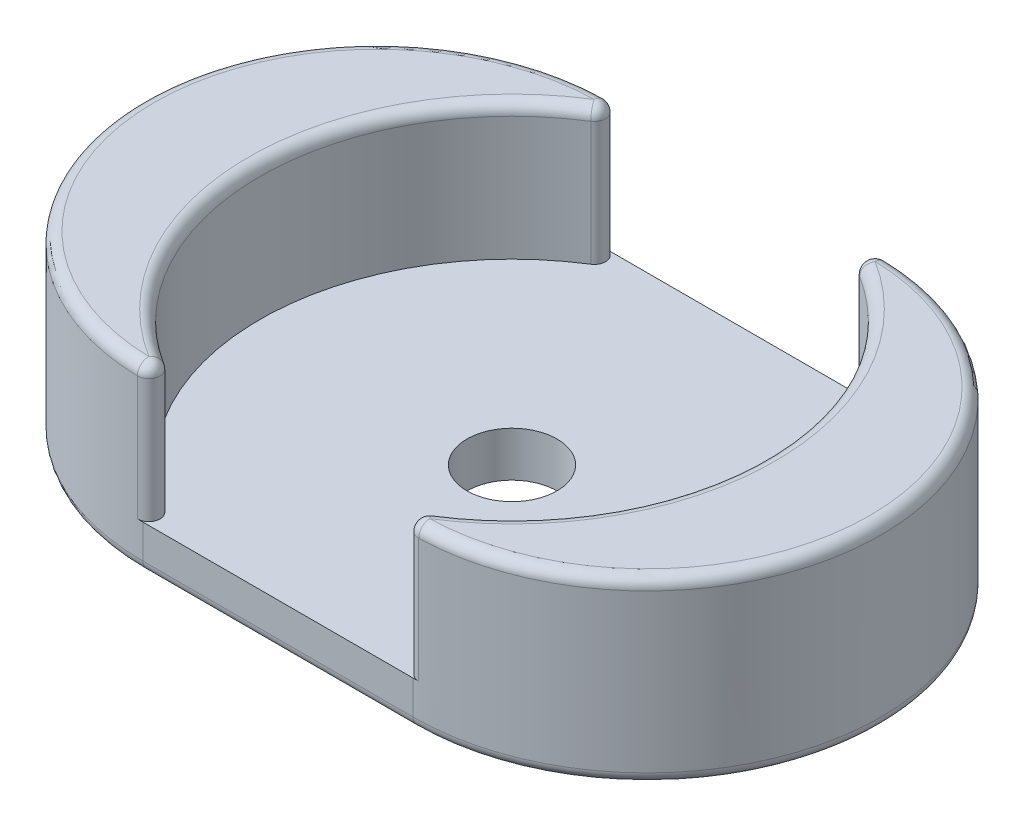
ISO-10303-21;
HEADER;
FILE_DESCRIPTION(('STEP AP214'),'2;1');
FILE_NAME('part.step','',(''),(''),'','','');
FILE_SCHEMA(('AUTOMOTIVE_DESIGN { 1 0 10303 214 1 1 1 1 }'));
ENDSEC;
DATA;
#1=APPLICATION_CONTEXT('core data for automotive mechanical design processes');
#2=APPLICATION_PROTOCOL_DEFINITION('international standard','automotive_design',2000,#1);
#3=PRODUCT_CONTEXT('',#1,'mechanical');
#4=PRODUCT('Part','Part','',(#3));
#5=PRODUCT_RELATED_PRODUCT_CATEGORY('part','',(#4));
#6=PRODUCT_DEFINITION_FORMATION('','',#4);
#7=PRODUCT_DEFINITION_CONTEXT('part definition',#1,'design');
#8=PRODUCT_DEFINITION('design','',#6,#7);
#9=PRODUCT_DEFINITION_SHAPE('','',#8);
#10=(LENGTH_UNIT() NAMED_UNIT(*) SI_UNIT(.MILLI.,.METRE.));
#11=(NAMED_UNIT(*) PLANE_ANGLE_UNIT() SI_UNIT($,.RADIAN.));
#12=(NAMED_UNIT(*) SI_UNIT($,.STERADIAN.) SOLID_ANGLE_UNIT());
#13=UNCERTAINTY_MEASURE_WITH_UNIT(LENGTH_MEASURE(1.E-05),#10,'distance_accuracy_value','');
#14=(GEOMETRIC_REPRESENTATION_CONTEXT(3) GLOBAL_UNCERTAINTY_ASSIGNED_CONTEXT((#13)) GLOBAL_UNIT_ASSIGNED_CONTEXT((#10,
#11,#12)) REPRESENTATION_CONTEXT('',''));
#15=CARTESIAN_POINT('',(0.,0.,0.));
#16=DIRECTION('',(0.,0.,1.));
#17=DIRECTION('',(1.,0.,0.));
#18=AXIS2_PLACEMENT_3D('',#15,#16,#17);
#19=CARTESIAN_POINT('',(0.,2.,0.));
#20=DIRECTION('',(0.,-1.,0.));
#21=DIRECTION('',(0.,0.,-1.));
#22=AXIS2_PLACEMENT_3D('',#19,#20,#21);
#23=CYLINDRICAL_SURFACE('',#22,2.8);
#24=DIRECTION('',(0.,-1.,0.));
#25=VECTOR('',#24,1.);
#26=CARTESIAN_POINT('',(-1.49333333333334,2.,-2.36853447421724));
#27=LINE('',#26,#25);
#28=CARTESIAN_POINT('',(-1.49333333333334,0.5,-2.36853447421724));
#29=VERTEX_POINT('',#28);
#30=CARTESIAN_POINT('',(-1.49333333333334,1.875,-2.36853447421724));
#31=VERTEX_POINT('',#30);
#32=EDGE_CURVE('E210',#29,#31,#27,.F.);
#33=ORIENTED_EDGE('',*,*,#32,.T.);
#34=CARTESIAN_POINT('',(0.,1.875,0.));
#35=DIRECTION('',(0.,1.,0.));
#36=DIRECTION('',(0.,0.,1.));
#37=AXIS2_PLACEMENT_3D('',#34,#35,#36);
#38=CIRCLE('',#37,2.8);
#39=CARTESIAN_POINT('',(-1.49333333333333,1.875,2.36853447421724));
#40=VERTEX_POINT('',#39);
#41=EDGE_CURVE('E267',#31,#40,#38,.T.);
#42=ORIENTED_EDGE('',*,*,#41,.T.);
#43=DIRECTION('',(0.,-1.,0.));
#44=VECTOR('',#43,1.);
#45=CARTESIAN_POINT('',(-1.49333333333333,2.,2.36853447421724));
#46=LINE('',#45,#44);
#47=CARTESIAN_POINT('',(-1.49333333333333,0.5,2.36853447421724));
#48=VERTEX_POINT('',#47);
#49=EDGE_CURVE('E213',#40,#48,#46,.T.);
#50=ORIENTED_EDGE('',*,*,#49,.T.);
#51=CARTESIAN_POINT('',(0.,0.5,0.));
#52=DIRECTION('',(0.,1.,0.));
#53=DIRECTION('',(0.,0.,1.));
#54=AXIS2_PLACEMENT_3D('',#51,#52,#53);
#55=CIRCLE('',#54,2.8);
#56=EDGE_CURVE('E186',#29,#48,#55,.T.);
#57=ORIENTED_EDGE('',*,*,#56,.F.);
#58=EDGE_LOOP('',(#33,#42,#50,#57));
#59=FACE_BOUND('',#58,.T.);
#60=ADVANCED_FACE('F39',(#59),#23,.F.);
#61=CARTESIAN_POINT('',(0.,2.,-2.6));
#62=DIRECTION('',(0.,0.,-1.));
#63=DIRECTION('',(-1.,0.,0.));
#64=AXIS2_PLACEMENT_3D('',#61,#62,#63);
#65=PLANE('',#64);
#66=DIRECTION('',(0.,-1.,0.));
#67=VECTOR('',#66,1.);
#68=CARTESIAN_POINT('',(1.5,2.,-2.6));
#69=LINE('',#68,#67);
#70=CARTESIAN_POINT('',(1.5,0.5,-2.6));
#71=VERTEX_POINT('',#70);
#72=CARTESIAN_POINT('',(1.5,0.125,-2.6));
#73=VERTEX_POINT('',#72);
#74=EDGE_CURVE('E179',#71,#73,#69,.T.);
#75=ORIENTED_EDGE('',*,*,#74,.T.);
#76=DIRECTION('',(1.,0.,0.));
#77=VECTOR('',#76,1.);
#78=CARTESIAN_POINT('',(-1.5,0.125,-2.6));
#79=LINE('',#78,#77);
#80=CARTESIAN_POINT('',(-1.5,0.125,-2.6));
#81=VERTEX_POINT('',#80);
#82=EDGE_CURVE('E246',#73,#81,#79,.F.);
#83=ORIENTED_EDGE('',*,*,#82,.T.);
#84=DIRECTION('',(0.,-1.,0.));
#85=VECTOR('',#84,1.);
#86=CARTESIAN_POINT('',(-1.5,2.,-2.6));
#87=LINE('',#86,#85);
#88=CARTESIAN_POINT('',(-1.5,0.5,-2.6));
#89=VERTEX_POINT('',#88);
#90=EDGE_CURVE('E193',#89,#81,#87,.T.);
#91=ORIENTED_EDGE('',*,*,#90,.F.);
#92=DIRECTION('',(1.,0.,0.));
#93=VECTOR('',#92,1.);
#94=CARTESIAN_POINT('',(0.,0.5,-2.6));
#95=LINE('',#94,#93);
#96=EDGE_CURVE('E190',#89,#71,#95,.T.);
#97=ORIENTED_EDGE('',*,*,#96,.T.);
#98=EDGE_LOOP('',(#75,#83,#91,#97));
#99=FACE_BOUND('',#98,.T.);
#100=ADVANCED_FACE('F334',(#99),#65,.T.);
#101=CARTESIAN_POINT('',(-1.5,2.,0.));
#102=DIRECTION('',(0.,-1.,0.));
#103=DIRECTION('',(0.,0.,-1.));
#104=AXIS2_PLACEMENT_3D('',#101,#102,#103);
#105=CYLINDRICAL_SURFACE('',#104,2.6);
#106=ORIENTED_EDGE('',*,*,#90,.T.);
#107=CARTESIAN_POINT('',(-1.5,0.125,0.));
#108=DIRECTION('',(0.,1.,0.));
#109=DIRECTION('',(0.,0.,1.));
#110=AXIS2_PLACEMENT_3D('',#107,#108,#109);
#111=CIRCLE('',#110,2.6);
#112=CARTESIAN_POINT('',(-1.5,0.125,2.6));
#113=VERTEX_POINT('',#112);
#114=EDGE_CURVE('E234',#81,#113,#111,.T.);
#115=ORIENTED_EDGE('',*,*,#114,.T.);
#116=DIRECTION('',(0.,-1.,0.));
#117=VECTOR('',#116,1.);
#118=CARTESIAN_POINT('',(-1.5,2.,2.6));
#119=LINE('',#118,#117);
#120=CARTESIAN_POINT('',(-1.5,0.5,2.6));
#121=VERTEX_POINT('',#120);
#122=EDGE_CURVE('E189',#121,#113,#119,.T.);
#123=ORIENTED_EDGE('',*,*,#122,.F.);
#124=CARTESIAN_POINT('',(-1.5,0.5,0.));
#125=DIRECTION('',(0.,1.,0.));
#126=DIRECTION('',(0.,0.,1.));
#127=AXIS2_PLACEMENT_3D('',#124,#125,#126);
#128=CIRCLE('',#127,2.6);
#129=CARTESIAN_POINT('',(-1.5630303030303,0.5,2.5992358840436));
#130=VERTEX_POINT('',#129);
#131=EDGE_CURVE('E160',#121,#130,#128,.F.);
#132=ORIENTED_EDGE('',*,*,#131,.T.);
#133=DIRECTION('',(0.,-1.,0.));
#134=VECTOR('',#133,1.);
#135=CARTESIAN_POINT('',(-1.5630303030303,2.,2.5992358840436));
#136=LINE('',#135,#134);
#137=CARTESIAN_POINT('',(-1.5630303030303,1.875,2.5992358840436));
#138=VERTEX_POINT('',#137);
#139=EDGE_CURVE('E220',#130,#138,#136,.F.);
#140=ORIENTED_EDGE('',*,*,#139,.T.);
#141=CARTESIAN_POINT('',(-1.5,1.875,0.));
#142=DIRECTION('',(0.,1.,0.));
#143=DIRECTION('',(0.,0.,1.));
#144=AXIS2_PLACEMENT_3D('',#141,#142,#143);
#145=CIRCLE('',#144,2.6);
#146=CARTESIAN_POINT('',(-1.5630303030303,1.875,-2.5992358840436));
#147=VERTEX_POINT('',#146);
#148=EDGE_CURVE('E232',#138,#147,#145,.F.);
#149=ORIENTED_EDGE('',*,*,#148,.T.);
#150=DIRECTION('',(0.,-1.,0.));
#151=VECTOR('',#150,1.);
#152=CARTESIAN_POINT('',(-1.5630303030303,2.,-2.5992358840436));
#153=LINE('',#152,#151);
#154=CARTESIAN_POINT('',(-1.5630303030303,0.5,-2.5992358840436));
#155=VERTEX_POINT('',#154);
#156=EDGE_CURVE('E218',#147,#155,#153,.T.);
#157=ORIENTED_EDGE('',*,*,#156,.T.);
#158=CARTESIAN_POINT('',(-1.5,0.5,0.));
#159=DIRECTION('',(0.,1.,0.));
#160=DIRECTION('',(0.,0.,1.));
#161=AXIS2_PLACEMENT_3D('',#158,#159,#160);
#162=CIRCLE('',#161,2.6);
#163=EDGE_CURVE('E215',#155,#89,#162,.F.);
#164=ORIENTED_EDGE('',*,*,#163,.T.);
#165=EDGE_LOOP('',(#106,#115,#123,#132,#140,#149,#157,#164));
#166=FACE_BOUND('',#165,.T.);
#167=ADVANCED_FACE('F313',(#166),#105,.T.);
#168=CARTESIAN_POINT('',(0.,2.,2.6));
#169=DIRECTION('',(0.,0.,-1.));
#170=DIRECTION('',(-1.,0.,0.));
#171=AXIS2_PLACEMENT_3D('',#168,#169,#170);
#172=PLANE('',#171);
#173=ORIENTED_EDGE('',*,*,#122,.T.);
#174=DIRECTION('',(1.,0.,0.));
#175=VECTOR('',#174,1.);
#176=CARTESIAN_POINT('',(0.,0.125,2.6));
#177=LINE('',#176,#175);
#178=CARTESIAN_POINT('',(1.5,0.125,2.6));
#179=VERTEX_POINT('',#178);
#180=EDGE_CURVE('E11',#113,#179,#177,.T.);
#181=ORIENTED_EDGE('',*,*,#180,.T.);
#182=DIRECTION('',(0.,-1.,0.));
#183=VECTOR('',#182,1.);
#184=CARTESIAN_POINT('',(1.5,2.,2.6));
#185=LINE('',#184,#183);
#186=CARTESIAN_POINT('',(1.5,0.5,2.6));
#187=VERTEX_POINT('',#186);
#188=EDGE_CURVE('E166',#187,#179,#185,.T.);
#189=ORIENTED_EDGE('',*,*,#188,.F.);
#190=DIRECTION('',(1.,0.,0.));
#191=VECTOR('',#190,1.);
#192=CARTESIAN_POINT('',(0.,0.5,2.6));
#193=LINE('',#192,#191);
#194=EDGE_CURVE('E155',#121,#187,#193,.T.);
#195=ORIENTED_EDGE('',*,*,#194,.F.);
#196=EDGE_LOOP('',(#173,#181,#189,#195));
#197=FACE_BOUND('',#196,.T.);
#198=ADVANCED_FACE('F177',(#197),#172,.F.);
#199=CARTESIAN_POINT('',(0.,2.,0.));
#200=DIRECTION('',(0.,1.,0.));
#201=DIRECTION('',(0.,0.,1.));
#202=AXIS2_PLACEMENT_3D('',#199,#200,#201);
#203=PLANE('',#202);
#204=CARTESIAN_POINT('',(-1.5,2.,0.));
#205=DIRECTION('',(0.,1.,0.));
#206=DIRECTION('',(0.,0.,1.));
#207=AXIS2_PLACEMENT_3D('',#204,#205,#206);
#208=CIRCLE('',#207,2.475);
#209=CARTESIAN_POINT('',(-1.56,2.,-2.47427262038766));
#210=VERTEX_POINT('',#209);
#211=CARTESIAN_POINT('',(-1.56,2.,2.47427262038766));
#212=VERTEX_POINT('',#211);
#213=EDGE_CURVE('E55',#210,#212,#208,.T.);
#214=ORIENTED_EDGE('',*,*,#213,.T.);
#215=CARTESIAN_POINT('',(0.,2.,0.));
#216=DIRECTION('',(0.,1.,0.));
#217=DIRECTION('',(0.,0.,1.));
#218=AXIS2_PLACEMENT_3D('',#215,#216,#217);
#219=CIRCLE('',#218,2.925);
#220=EDGE_CURVE('E270',#212,#210,#219,.F.);
#221=ORIENTED_EDGE('',*,*,#220,.T.);
#222=EDGE_LOOP('',(#214,#221));
#223=FACE_BOUND('',#222,.T.);
#224=ADVANCED_FACE('F559',(#223),#203,.T.);
#225=CARTESIAN_POINT('',(0.,0.,0.));
#226=DIRECTION('',(0.,1.,0.));
#227=DIRECTION('',(0.,0.,1.));
#228=AXIS2_PLACEMENT_3D('',#225,#226,#227);
#229=PLANE('',#228);
#230=DIRECTION('',(1.,0.,0.));
#231=VECTOR('',#230,1.);
#232=CARTESIAN_POINT('',(0.,0.,2.475));
#233=LINE('',#232,#231);
#234=CARTESIAN_POINT('',(1.5,0.,2.475));
#235=VERTEX_POINT('',#234);
#236=CARTESIAN_POINT('',(-1.5,0.,2.475));
#237=VERTEX_POINT('',#236);
#238=EDGE_CURVE('E237',#235,#237,#233,.F.);
#239=ORIENTED_EDGE('',*,*,#238,.T.);
#240=CARTESIAN_POINT('',(-1.5,0.,0.));
#241=DIRECTION('',(0.,1.,0.));
#242=DIRECTION('',(0.,0.,1.));
#243=AXIS2_PLACEMENT_3D('',#240,#241,#242);
#244=CIRCLE('',#243,2.475);
#245=CARTESIAN_POINT('',(-1.5,0.,-2.475));
#246=VERTEX_POINT('',#245);
#247=EDGE_CURVE('E243',#237,#246,#244,.F.);
#248=ORIENTED_EDGE('',*,*,#247,.T.);
#249=DIRECTION('',(1.,0.,0.));
#250=VECTOR('',#249,1.);
#251=CARTESIAN_POINT('',(1.5,0.,-2.475));
#252=LINE('',#251,#250);
#253=CARTESIAN_POINT('',(1.5,0.,-2.475));
#254=VERTEX_POINT('',#253);
#255=EDGE_CURVE('E241',#246,#254,#252,.T.);
#256=ORIENTED_EDGE('',*,*,#255,.T.);
#257=CARTESIAN_POINT('',(1.5,0.,0.));
#258=DIRECTION('',(0.,1.,0.));
#259=DIRECTION('',(0.,0.,1.));
#260=AXIS2_PLACEMENT_3D('',#257,#258,#259);
#261=CIRCLE('',#260,2.475);
#262=EDGE_CURVE('E239',#254,#235,#261,.F.);
#263=ORIENTED_EDGE('',*,*,#262,.T.);
#264=EDGE_LOOP('',(#239,#248,#256,#263));
#265=FACE_BOUND('',#264,.T.);
#266=CARTESIAN_POINT('',(0.,0.,0.));
#267=DIRECTION('',(0.,1.,0.));
#268=DIRECTION('',(0.,0.,1.));
#269=AXIS2_PLACEMENT_3D('',#266,#267,#268);
#270=CIRCLE('',#269,0.5);
#271=CARTESIAN_POINT('',(0.,0.,0.5));
#272=VERTEX_POINT('',#271);
#273=EDGE_CURVE('E199',#272,#272,#270,.T.);
#274=ORIENTED_EDGE('',*,*,#273,.T.);
#275=EDGE_LOOP('',(#274));
#276=FACE_BOUND('',#275,.T.);
#277=ADVANCED_FACE('F523',(#265,#276),#229,.F.);
#278=CARTESIAN_POINT('',(0.,0.5,0.));
#279=DIRECTION('',(0.,1.,0.));
#280=DIRECTION('',(0.,0.,1.));
#281=AXIS2_PLACEMENT_3D('',#278,#279,#280);
#282=PLANE('',#281);
#283=CARTESIAN_POINT('',(0.,0.5,0.));
#284=DIRECTION('',(0.,1.,0.));
#285=DIRECTION('',(0.,0.,1.));
#286=AXIS2_PLACEMENT_3D('',#283,#284,#285);
#287=CIRCLE('',#286,0.5);
#288=CARTESIAN_POINT('',(0.,0.5,0.5));
#289=VERTEX_POINT('',#288);
#290=EDGE_CURVE('E182',#289,#289,#287,.F.);
#291=ORIENTED_EDGE('',*,*,#290,.T.);
#292=EDGE_LOOP('',(#291));
#293=FACE_BOUND('',#292,.T.);
#294=ORIENTED_EDGE('',*,*,#194,.T.);
#295=CARTESIAN_POINT('',(1.5,0.5,0.));
#296=DIRECTION('',(0.,1.,0.));
#297=DIRECTION('',(0.,0.,1.));
#298=AXIS2_PLACEMENT_3D('',#295,#296,#297);
#299=CIRCLE('',#298,2.6);
#300=CARTESIAN_POINT('',(1.5630303030303,0.5,2.5992358840436));
#301=VERTEX_POINT('',#300);
#302=EDGE_CURVE('E158',#301,#187,#299,.F.);
#303=ORIENTED_EDGE('',*,*,#302,.F.);
#304=CARTESIAN_POINT('',(1.56,0.5,2.47427262038766));
#305=DIRECTION('',(0.,1.,0.));
#306=DIRECTION('',(0.,0.,1.));
#307=AXIS2_PLACEMENT_3D('',#304,#305,#306);
#308=CIRCLE('',#307,0.125);
#309=CARTESIAN_POINT('',(1.49333333333333,0.5,2.36853447421724));
#310=VERTEX_POINT('',#309);
#311=EDGE_CURVE('E224',#301,#310,#308,.F.);
#312=ORIENTED_EDGE('',*,*,#311,.T.);
#313=CARTESIAN_POINT('',(1.49333333333333,0.5,-2.36853447421724));
#314=VERTEX_POINT('',#313);
#315=EDGE_CURVE('E165',#310,#314,#55,.T.);
#316=ORIENTED_EDGE('',*,*,#315,.T.);
#317=CARTESIAN_POINT('',(1.56,0.5,-2.47427262038766));
#318=DIRECTION('',(0.,1.,0.));
#319=DIRECTION('',(0.,0.,1.));
#320=AXIS2_PLACEMENT_3D('',#317,#318,#319);
#321=CIRCLE('',#320,0.125);
#322=CARTESIAN_POINT('',(1.5630303030303,0.5,-2.5992358840436));
#323=VERTEX_POINT('',#322);
#324=EDGE_CURVE('E226',#314,#323,#321,.F.);
#325=ORIENTED_EDGE('',*,*,#324,.T.);
#326=CARTESIAN_POINT('',(1.5,0.5,0.));
#327=DIRECTION('',(0.,1.,0.));
#328=DIRECTION('',(0.,0.,1.));
#329=AXIS2_PLACEMENT_3D('',#326,#327,#328);
#330=CIRCLE('',#329,2.6);
#331=EDGE_CURVE('E175',#71,#323,#330,.F.);
#332=ORIENTED_EDGE('',*,*,#331,.F.);
#333=ORIENTED_EDGE('',*,*,#96,.F.);
#334=ORIENTED_EDGE('',*,*,#163,.F.);
#335=CARTESIAN_POINT('',(-1.56,0.5,-2.47427262038766));
#336=DIRECTION('',(0.,1.,0.));
#337=DIRECTION('',(0.,0.,1.));
#338=AXIS2_PLACEMENT_3D('',#335,#336,#337);
#339=CIRCLE('',#338,0.125);
#340=EDGE_CURVE('E230',#155,#29,#339,.F.);
#341=ORIENTED_EDGE('',*,*,#340,.T.);
#342=ORIENTED_EDGE('',*,*,#56,.T.);
#343=CARTESIAN_POINT('',(-1.56,0.5,2.47427262038766));
#344=DIRECTION('',(0.,1.,0.));
#345=DIRECTION('',(0.,0.,1.));
#346=AXIS2_PLACEMENT_3D('',#343,#344,#345);
#347=CIRCLE('',#346,0.125);
#348=EDGE_CURVE('E228',#48,#130,#347,.F.);
#349=ORIENTED_EDGE('',*,*,#348,.T.);
#350=ORIENTED_EDGE('',*,*,#131,.F.);
#351=EDGE_LOOP('',(#294,#303,#312,#316,#325,#332,#333,#334,#341,#342,#349,#350));
#352=FACE_BOUND('',#351,.T.);
#353=ADVANCED_FACE('F157',(#293,#352),#282,.T.);
#354=CARTESIAN_POINT('',(0.,2.,0.));
#355=DIRECTION('',(0.,-1.,0.));
#356=DIRECTION('',(0.,0.,-1.));
#357=AXIS2_PLACEMENT_3D('',#354,#355,#356);
#358=CYLINDRICAL_SURFACE('',#357,2.8);
#359=DIRECTION('',(0.,-1.,0.));
#360=VECTOR('',#359,1.);
#361=CARTESIAN_POINT('',(1.49333333333333,2.,2.36853447421724));
#362=LINE('',#361,#360);
#363=CARTESIAN_POINT('',(1.49333333333333,1.875,2.36853447421724));
#364=VERTEX_POINT('',#363);
#365=EDGE_CURVE('E207',#310,#364,#362,.F.);
#366=ORIENTED_EDGE('',*,*,#365,.T.);
#367=CARTESIAN_POINT('',(0.,1.875,0.));
#368=DIRECTION('',(0.,1.,0.));
#369=DIRECTION('',(0.,0.,1.));
#370=AXIS2_PLACEMENT_3D('',#367,#368,#369);
#371=CIRCLE('',#370,2.8);
#372=CARTESIAN_POINT('',(1.49333333333333,1.875,-2.36853447421724));
#373=VERTEX_POINT('',#372);
#374=EDGE_CURVE('E262',#364,#373,#371,.T.);
#375=ORIENTED_EDGE('',*,*,#374,.T.);
#376=DIRECTION('',(0.,-1.,0.));
#377=VECTOR('',#376,1.);
#378=CARTESIAN_POINT('',(1.49333333333333,2.,-2.36853447421724));
#379=LINE('',#378,#377);
#380=EDGE_CURVE('E205',#373,#314,#379,.T.);
#381=ORIENTED_EDGE('',*,*,#380,.T.);
#382=ORIENTED_EDGE('',*,*,#315,.F.);
#383=EDGE_LOOP('',(#366,#375,#381,#382));
#384=FACE_BOUND('',#383,.T.);
#385=ADVANCED_FACE('F522',(#384),#358,.F.);
#386=CARTESIAN_POINT('',(1.5,2.,0.));
#387=DIRECTION('',(0.,-1.,0.));
#388=DIRECTION('',(0.,0.,-1.));
#389=AXIS2_PLACEMENT_3D('',#386,#387,#388);
#390=CYLINDRICAL_SURFACE('',#389,2.6);
#391=ORIENTED_EDGE('',*,*,#188,.T.);
#392=CARTESIAN_POINT('',(1.5,0.125,0.));
#393=DIRECTION('',(0.,1.,0.));
#394=DIRECTION('',(0.,0.,1.));
#395=AXIS2_PLACEMENT_3D('',#392,#393,#394);
#396=CIRCLE('',#395,2.6);
#397=EDGE_CURVE('E250',#179,#73,#396,.T.);
#398=ORIENTED_EDGE('',*,*,#397,.T.);
#399=ORIENTED_EDGE('',*,*,#74,.F.);
#400=ORIENTED_EDGE('',*,*,#331,.T.);
#401=DIRECTION('',(0.,-1.,0.));
#402=VECTOR('',#401,1.);
#403=CARTESIAN_POINT('',(1.5630303030303,2.,-2.5992358840436));
#404=LINE('',#403,#402);
#405=CARTESIAN_POINT('',(1.5630303030303,1.875,-2.5992358840436));
#406=VERTEX_POINT('',#405);
#407=EDGE_CURVE('E196',#323,#406,#404,.F.);
#408=ORIENTED_EDGE('',*,*,#407,.T.);
#409=CARTESIAN_POINT('',(1.5,1.875,0.));
#410=DIRECTION('',(0.,1.,0.));
#411=DIRECTION('',(0.,0.,1.));
#412=AXIS2_PLACEMENT_3D('',#409,#410,#411);
#413=CIRCLE('',#412,2.6);
#414=CARTESIAN_POINT('',(1.5630303030303,1.875,2.5992358840436));
#415=VERTEX_POINT('',#414);
#416=EDGE_CURVE('E248',#406,#415,#413,.F.);
#417=ORIENTED_EDGE('',*,*,#416,.T.);
#418=DIRECTION('',(0.,-1.,0.));
#419=VECTOR('',#418,1.);
#420=CARTESIAN_POINT('',(1.5630303030303,2.,2.5992358840436));
#421=LINE('',#420,#419);
#422=EDGE_CURVE('E173',#415,#301,#421,.T.);
#423=ORIENTED_EDGE('',*,*,#422,.T.);
#424=ORIENTED_EDGE('',*,*,#302,.T.);
#425=EDGE_LOOP('',(#391,#398,#399,#400,#408,#417,#423,#424));
#426=FACE_BOUND('',#425,.T.);
#427=ADVANCED_FACE('F170',(#426),#390,.T.);
#428=CARTESIAN_POINT('',(0.,2.,0.));
#429=DIRECTION('',(0.,1.,0.));
#430=DIRECTION('',(0.,0.,1.));
#431=AXIS2_PLACEMENT_3D('',#428,#429,#430);
#432=PLANE('',#431);
#433=CARTESIAN_POINT('',(0.,2.,0.));
#434=DIRECTION('',(0.,1.,0.));
#435=DIRECTION('',(0.,0.,1.));
#436=AXIS2_PLACEMENT_3D('',#433,#434,#435);
#437=CIRCLE('',#436,2.925);
#438=CARTESIAN_POINT('',(1.56,2.,-2.47427262038766));
#439=VERTEX_POINT('',#438);
#440=CARTESIAN_POINT('',(1.56,2.,2.47427262038766));
#441=VERTEX_POINT('',#440);
#442=EDGE_CURVE('E255',#439,#441,#437,.F.);
#443=ORIENTED_EDGE('',*,*,#442,.T.);
#444=CARTESIAN_POINT('',(1.5,2.,0.));
#445=DIRECTION('',(0.,1.,0.));
#446=DIRECTION('',(0.,0.,1.));
#447=AXIS2_PLACEMENT_3D('',#444,#445,#446);
#448=CIRCLE('',#447,2.475);
#449=EDGE_CURVE('E257',#441,#439,#448,.T.);
#450=ORIENTED_EDGE('',*,*,#449,.T.);
#451=EDGE_LOOP('',(#443,#450));
#452=FACE_BOUND('',#451,.T.);
#453=ADVANCED_FACE('F357',(#452),#432,.T.);
#454=CARTESIAN_POINT('',(0.,1.,0.));
#455=DIRECTION('',(0.,-1.,0.));
#456=DIRECTION('',(0.,0.,-1.));
#457=AXIS2_PLACEMENT_3D('',#454,#455,#456);
#458=CYLINDRICAL_SURFACE('',#457,0.5);
#459=ORIENTED_EDGE('',*,*,#290,.F.);
#460=EDGE_LOOP('',(#459));
#461=FACE_BOUND('',#460,.T.);
#462=ORIENTED_EDGE('',*,*,#273,.F.);
#463=EDGE_LOOP('',(#462));
#464=FACE_BOUND('',#463,.T.);
#465=ADVANCED_FACE('F386',(#461,#464),#458,.F.);
#466=CARTESIAN_POINT('',(1.56,2.,2.47427262038766));
#467=DIRECTION('',(0.,1.,0.));
#468=DIRECTION('',(0.,0.,1.));
#469=AXIS2_PLACEMENT_3D('',#466,#467,#468);
#470=CYLINDRICAL_SURFACE('',#469,0.125);
#471=ORIENTED_EDGE('',*,*,#422,.F.);
#472=CARTESIAN_POINT('',(1.56,1.875,2.47427262038766));
#473=DIRECTION('',(0.,1.,0.));
#474=DIRECTION('',(0.,0.,1.));
#475=AXIS2_PLACEMENT_3D('',#472,#473,#474);
#476=CIRCLE('',#475,0.125);
#477=EDGE_CURVE('E260',#415,#364,#476,.F.);
#478=ORIENTED_EDGE('',*,*,#477,.T.);
#479=ORIENTED_EDGE('',*,*,#365,.F.);
#480=ORIENTED_EDGE('',*,*,#311,.F.);
#481=EDGE_LOOP('',(#471,#478,#479,#480));
#482=FACE_BOUND('',#481,.T.);
#483=ADVANCED_FACE('F362',(#482),#470,.T.);
#484=CARTESIAN_POINT('',(1.56,2.,-2.47427262038766));
#485=DIRECTION('',(0.,1.,0.));
#486=DIRECTION('',(0.,0.,1.));
#487=AXIS2_PLACEMENT_3D('',#484,#485,#486);
#488=CYLINDRICAL_SURFACE('',#487,0.125);
#489=ORIENTED_EDGE('',*,*,#380,.F.);
#490=CARTESIAN_POINT('',(1.56,1.875,-2.47427262038766));
#491=DIRECTION('',(0.,1.,0.));
#492=DIRECTION('',(0.,0.,1.));
#493=AXIS2_PLACEMENT_3D('',#490,#491,#492);
#494=CIRCLE('',#493,0.125);
#495=EDGE_CURVE('E252',#373,#406,#494,.F.);
#496=ORIENTED_EDGE('',*,*,#495,.T.);
#497=ORIENTED_EDGE('',*,*,#407,.F.);
#498=ORIENTED_EDGE('',*,*,#324,.F.);
#499=EDGE_LOOP('',(#489,#496,#497,#498));
#500=FACE_BOUND('',#499,.T.);
#501=ADVANCED_FACE('F342',(#500),#488,.T.);
#502=CARTESIAN_POINT('',(-1.56,2.,2.47427262038766));
#503=DIRECTION('',(0.,1.,0.));
#504=DIRECTION('',(0.,0.,1.));
#505=AXIS2_PLACEMENT_3D('',#502,#503,#504);
#506=CYLINDRICAL_SURFACE('',#505,0.125);
#507=ORIENTED_EDGE('',*,*,#49,.F.);
#508=CARTESIAN_POINT('',(-1.56,1.875,2.47427262038766));
#509=DIRECTION('',(0.,1.,0.));
#510=DIRECTION('',(0.,0.,1.));
#511=AXIS2_PLACEMENT_3D('',#508,#509,#510);
#512=CIRCLE('',#511,0.125);
#513=EDGE_CURVE('E48',#40,#138,#512,.F.);
#514=ORIENTED_EDGE('',*,*,#513,.T.);
#515=ORIENTED_EDGE('',*,*,#139,.F.);
#516=ORIENTED_EDGE('',*,*,#348,.F.);
#517=EDGE_LOOP('',(#507,#514,#515,#516));
#518=FACE_BOUND('',#517,.T.);
#519=ADVANCED_FACE('F310',(#518),#506,.T.);
#520=CARTESIAN_POINT('',(-1.56,2.,-2.47427262038766));
#521=DIRECTION('',(0.,1.,0.));
#522=DIRECTION('',(0.,0.,1.));
#523=AXIS2_PLACEMENT_3D('',#520,#521,#522);
#524=CYLINDRICAL_SURFACE('',#523,0.125);
#525=ORIENTED_EDGE('',*,*,#156,.F.);
#526=CARTESIAN_POINT('',(-1.56,1.875,-2.47427262038766));
#527=DIRECTION('',(0.,1.,0.));
#528=DIRECTION('',(0.,0.,1.));
#529=AXIS2_PLACEMENT_3D('',#526,#527,#528);
#530=CIRCLE('',#529,0.125);
#531=EDGE_CURVE('E264',#147,#31,#530,.F.);
#532=ORIENTED_EDGE('',*,*,#531,.T.);
#533=ORIENTED_EDGE('',*,*,#32,.F.);
#534=ORIENTED_EDGE('',*,*,#340,.F.);
#535=EDGE_LOOP('',(#525,#532,#533,#534));
#536=FACE_BOUND('',#535,.T.);
#537=ADVANCED_FACE('F391',(#536),#524,.T.);
#538=CARTESIAN_POINT('',(1.5,0.125,0.));
#539=DIRECTION('',(0.,1.,0.));
#540=DIRECTION('',(0.,0.,1.));
#541=AXIS2_PLACEMENT_3D('',#538,#539,#540);
#542=TOROIDAL_SURFACE('',#541,2.475,0.125);
#543=CARTESIAN_POINT('',(1.5,0.125,2.475));
#544=DIRECTION('',(-1.,0.,0.));
#545=DIRECTION('',(0.,0.,1.));
#546=AXIS2_PLACEMENT_3D('',#543,#544,#545);
#547=CIRCLE('',#546,0.125);
#548=EDGE_CURVE('E278',#235,#179,#547,.T.);
#549=ORIENTED_EDGE('',*,*,#548,.F.);
#550=ORIENTED_EDGE('',*,*,#262,.F.);
#551=CARTESIAN_POINT('',(1.5,0.125,-2.475));
#552=DIRECTION('',(-1.,0.,0.));
#553=DIRECTION('',(0.,0.,1.));
#554=AXIS2_PLACEMENT_3D('',#551,#552,#553);
#555=CIRCLE('',#554,0.125);
#556=EDGE_CURVE('E281',#73,#254,#555,.T.);
#557=ORIENTED_EDGE('',*,*,#556,.F.);
#558=ORIENTED_EDGE('',*,*,#397,.F.);
#559=EDGE_LOOP('',(#549,#550,#557,#558));
#560=FACE_BOUND('',#559,.T.);
#561=ADVANCED_FACE('F329',(#560),#542,.T.);
#562=CARTESIAN_POINT('',(0.,0.125,-2.475));
#563=DIRECTION('',(-1.,0.,0.));
#564=DIRECTION('',(0.,0.,1.));
#565=AXIS2_PLACEMENT_3D('',#562,#563,#564);
#566=CYLINDRICAL_SURFACE('',#565,0.125);
#567=ORIENTED_EDGE('',*,*,#556,.T.);
#568=ORIENTED_EDGE('',*,*,#255,.F.);
#569=CARTESIAN_POINT('',(-1.5,0.125,-2.475));
#570=DIRECTION('',(-1.,0.,0.));
#571=DIRECTION('',(0.,0.,1.));
#572=AXIS2_PLACEMENT_3D('',#569,#570,#571);
#573=CIRCLE('',#572,0.125);
#574=EDGE_CURVE('E275',#81,#246,#573,.T.);
#575=ORIENTED_EDGE('',*,*,#574,.F.);
#576=ORIENTED_EDGE('',*,*,#82,.F.);
#577=EDGE_LOOP('',(#567,#568,#575,#576));
#578=FACE_BOUND('',#577,.T.);
#579=ADVANCED_FACE('F397',(#578),#566,.T.);
#580=CARTESIAN_POINT('',(0.,0.125,2.475));
#581=DIRECTION('',(1.,0.,0.));
#582=DIRECTION('',(0.,0.,-1.));
#583=AXIS2_PLACEMENT_3D('',#580,#581,#582);
#584=CYLINDRICAL_SURFACE('',#583,0.125);
#585=ORIENTED_EDGE('',*,*,#548,.T.);
#586=ORIENTED_EDGE('',*,*,#180,.F.);
#587=CARTESIAN_POINT('',(-1.5,0.125,2.475));
#588=DIRECTION('',(-1.,0.,0.));
#589=DIRECTION('',(0.,0.,1.));
#590=AXIS2_PLACEMENT_3D('',#587,#588,#589);
#591=CIRCLE('',#590,0.125);
#592=EDGE_CURVE('E273',#237,#113,#591,.T.);
#593=ORIENTED_EDGE('',*,*,#592,.F.);
#594=ORIENTED_EDGE('',*,*,#238,.F.);
#595=EDGE_LOOP('',(#585,#586,#593,#594));
#596=FACE_BOUND('',#595,.T.);
#597=ADVANCED_FACE('F325',(#596),#584,.T.);
#598=CARTESIAN_POINT('',(-1.5,0.125,0.));
#599=DIRECTION('',(0.,1.,0.));
#600=DIRECTION('',(0.,0.,1.));
#601=AXIS2_PLACEMENT_3D('',#598,#599,#600);
#602=TOROIDAL_SURFACE('',#601,2.475,0.125);
#603=ORIENTED_EDGE('',*,*,#574,.T.);
#604=ORIENTED_EDGE('',*,*,#247,.F.);
#605=ORIENTED_EDGE('',*,*,#592,.T.);
#606=ORIENTED_EDGE('',*,*,#114,.F.);
#607=EDGE_LOOP('',(#603,#604,#605,#606));
#608=FACE_BOUND('',#607,.T.);
#609=ADVANCED_FACE('F319',(#608),#602,.T.);
#610=CARTESIAN_POINT('',(1.56,1.875,2.47427262038766));
#611=DIRECTION('',(0.,1.,0.));
#612=DIRECTION('',(0.,0.,1.));
#613=AXIS2_PLACEMENT_3D('',#610,#611,#612);
#614=SPHERICAL_SURFACE('',#613,0.125);
#615=CARTESIAN_POINT('',(1.56,1.875,2.47427262038766));
#616=DIRECTION('',(0.845905169363302,0.,-0.533333333333333));
#617=DIRECTION('',(-0.533333333333333,0.,-0.845905169363302));
#618=AXIS2_PLACEMENT_3D('',#615,#616,#617);
#619=CIRCLE('',#618,0.125);
#620=EDGE_CURVE('E288',#364,#441,#619,.T.);
#621=ORIENTED_EDGE('',*,*,#620,.F.);
#622=ORIENTED_EDGE('',*,*,#477,.F.);
#623=CARTESIAN_POINT('',(1.56,1.875,2.47427262038766));
#624=DIRECTION('',(0.999706109247538,0.,-0.0242424242424249));
#625=DIRECTION('',(-0.0242424242424249,0.,-0.999706109247538));
#626=AXIS2_PLACEMENT_3D('',#623,#624,#625);
#627=CIRCLE('',#626,0.125);
#628=EDGE_CURVE('E276',#441,#415,#627,.T.);
#629=ORIENTED_EDGE('',*,*,#628,.F.);
#630=EDGE_LOOP('',(#621,#622,#629));
#631=FACE_BOUND('',#630,.T.);
#632=ADVANCED_FACE('F365',(#631),#614,.T.);
#633=CARTESIAN_POINT('',(1.5,1.875,0.));
#634=DIRECTION('',(0.,1.,0.));
#635=DIRECTION('',(0.,0.,1.));
#636=AXIS2_PLACEMENT_3D('',#633,#634,#635);
#637=TOROIDAL_SURFACE('',#636,2.475,0.125);
#638=ORIENTED_EDGE('',*,*,#628,.T.);
#639=ORIENTED_EDGE('',*,*,#416,.F.);
#640=CARTESIAN_POINT('',(1.56,1.875,-2.47427262038766));
#641=DIRECTION('',(-0.999706109247538,0.,-0.0242424242424249));
#642=DIRECTION('',(-0.0242424242424249,0.,0.999706109247538));
#643=AXIS2_PLACEMENT_3D('',#640,#641,#642);
#644=CIRCLE('',#643,0.125);
#645=EDGE_CURVE('E286',#439,#406,#644,.T.);
#646=ORIENTED_EDGE('',*,*,#645,.F.);
#647=ORIENTED_EDGE('',*,*,#449,.F.);
#648=EDGE_LOOP('',(#638,#639,#646,#647));
#649=FACE_BOUND('',#648,.T.);
#650=ADVANCED_FACE('F359',(#649),#637,.T.);
#651=CARTESIAN_POINT('',(0.,1.875,0.));
#652=DIRECTION('',(0.,1.,0.));
#653=DIRECTION('',(0.,0.,1.));
#654=AXIS2_PLACEMENT_3D('',#651,#652,#653);
#655=TOROIDAL_SURFACE('',#654,2.925,0.125);
#656=ORIENTED_EDGE('',*,*,#620,.T.);
#657=ORIENTED_EDGE('',*,*,#442,.F.);
#658=CARTESIAN_POINT('',(1.56,1.875,-2.47427262038766));
#659=DIRECTION('',(-0.845905169363302,0.,-0.533333333333333));
#660=DIRECTION('',(-0.533333333333333,0.,0.845905169363302));
#661=AXIS2_PLACEMENT_3D('',#658,#659,#660);
#662=CIRCLE('',#661,0.125);
#663=EDGE_CURVE('E284',#373,#439,#662,.T.);
#664=ORIENTED_EDGE('',*,*,#663,.F.);
#665=ORIENTED_EDGE('',*,*,#374,.F.);
#666=EDGE_LOOP('',(#656,#657,#664,#665));
#667=FACE_BOUND('',#666,.T.);
#668=ADVANCED_FACE('F352',(#667),#655,.T.);
#669=CARTESIAN_POINT('',(1.56,1.875,-2.47427262038766));
#670=DIRECTION('',(0.,1.,0.));
#671=DIRECTION('',(0.,0.,1.));
#672=AXIS2_PLACEMENT_3D('',#669,#670,#671);
#673=SPHERICAL_SURFACE('',#672,0.125);
#674=ORIENTED_EDGE('',*,*,#645,.T.);
#675=ORIENTED_EDGE('',*,*,#495,.F.);
#676=ORIENTED_EDGE('',*,*,#663,.T.);
#677=EDGE_LOOP('',(#674,#675,#676));
#678=FACE_BOUND('',#677,.T.);
#679=ADVANCED_FACE('F346',(#678),#673,.T.);
#680=CARTESIAN_POINT('',(-1.56,1.875,2.47427262038766));
#681=DIRECTION('',(0.,1.,0.));
#682=DIRECTION('',(0.,0.,1.));
#683=AXIS2_PLACEMENT_3D('',#680,#681,#682);
#684=SPHERICAL_SURFACE('',#683,0.125);
#685=CARTESIAN_POINT('',(-1.56,1.875,2.47427262038766));
#686=DIRECTION('',(-0.999706109247538,0.,-0.0242424242424249));
#687=DIRECTION('',(-0.0242424242424249,0.,0.999706109247538));
#688=AXIS2_PLACEMENT_3D('',#685,#686,#687);
#689=CIRCLE('',#688,0.125);
#690=EDGE_CURVE('E295',#138,#212,#689,.T.);
#691=ORIENTED_EDGE('',*,*,#690,.F.);
#692=ORIENTED_EDGE('',*,*,#513,.F.);
#693=CARTESIAN_POINT('',(-1.56,1.875,2.47427262038766));
#694=DIRECTION('',(-0.845905169363302,0.,-0.533333333333333));
#695=DIRECTION('',(-0.533333333333333,0.,0.845905169363302));
#696=AXIS2_PLACEMENT_3D('',#693,#694,#695);
#697=CIRCLE('',#696,0.125);
#698=EDGE_CURVE('E43',#212,#40,#697,.T.);
#699=ORIENTED_EDGE('',*,*,#698,.F.);
#700=EDGE_LOOP('',(#691,#692,#699));
#701=FACE_BOUND('',#700,.T.);
#702=ADVANCED_FACE('F41',(#701),#684,.T.);
#703=CARTESIAN_POINT('',(0.,1.875,0.));
#704=DIRECTION('',(0.,1.,0.));
#705=DIRECTION('',(0.,0.,1.));
#706=AXIS2_PLACEMENT_3D('',#703,#704,#705);
#707=TOROIDAL_SURFACE('',#706,2.925,0.125);
#708=ORIENTED_EDGE('',*,*,#698,.T.);
#709=ORIENTED_EDGE('',*,*,#41,.F.);
#710=CARTESIAN_POINT('',(-1.56,1.875,-2.47427262038766));
#711=DIRECTION('',(0.845905169363302,0.,-0.533333333333333));
#712=DIRECTION('',(-0.533333333333333,0.,-0.845905169363302));
#713=AXIS2_PLACEMENT_3D('',#710,#711,#712);
#714=CIRCLE('',#713,0.125);
#715=EDGE_CURVE('E294',#210,#31,#714,.T.);
#716=ORIENTED_EDGE('',*,*,#715,.F.);
#717=ORIENTED_EDGE('',*,*,#220,.F.);
#718=EDGE_LOOP('',(#708,#709,#716,#717));
#719=FACE_BOUND('',#718,.T.);
#720=ADVANCED_FACE('F304',(#719),#707,.T.);
#721=CARTESIAN_POINT('',(-1.5,1.875,0.));
#722=DIRECTION('',(0.,1.,0.));
#723=DIRECTION('',(0.,0.,1.));
#724=AXIS2_PLACEMENT_3D('',#721,#722,#723);
#725=TOROIDAL_SURFACE('',#724,2.475,0.125);
#726=ORIENTED_EDGE('',*,*,#690,.T.);
#727=ORIENTED_EDGE('',*,*,#213,.F.);
#728=CARTESIAN_POINT('',(-1.56,1.875,-2.47427262038766));
#729=DIRECTION('',(0.999706109247538,0.,-0.0242424242424249));
#730=DIRECTION('',(-0.0242424242424249,0.,-0.999706109247538));
#731=AXIS2_PLACEMENT_3D('',#728,#729,#730);
#732=CIRCLE('',#731,0.125);
#733=EDGE_CURVE('E63',#147,#210,#732,.T.);
#734=ORIENTED_EDGE('',*,*,#733,.F.);
#735=ORIENTED_EDGE('',*,*,#148,.F.);
#736=EDGE_LOOP('',(#726,#727,#734,#735));
#737=FACE_BOUND('',#736,.T.);
#738=ADVANCED_FACE('F425',(#737),#725,.T.);
#739=CARTESIAN_POINT('',(-1.56,1.875,-2.47427262038766));
#740=DIRECTION('',(0.,1.,0.));
#741=DIRECTION('',(0.,0.,1.));
#742=AXIS2_PLACEMENT_3D('',#739,#740,#741);
#743=SPHERICAL_SURFACE('',#742,0.125);
#744=ORIENTED_EDGE('',*,*,#715,.T.);
#745=ORIENTED_EDGE('',*,*,#531,.F.);
#746=ORIENTED_EDGE('',*,*,#733,.T.);
#747=EDGE_LOOP('',(#744,#745,#746));
#748=FACE_BOUND('',#747,.T.);
#749=ADVANCED_FACE('F431',(#748),#743,.T.);
#750=CLOSED_SHELL('',(#60,#100,#167,#198,#224,#277,#353,#385,#427,#453,#465,#483,#501,#519,#537,
#561,#579,#597,#609,#632,#650,#668,#679,#702,#720,#738,#749));
#751=MANIFOLD_SOLID_BREP('B2',#750);
#752=ADVANCED_BREP_SHAPE_REPRESENTATION('',(#18,#751),#14);
#753=SHAPE_DEFINITION_REPRESENTATION(#9,#752);
ENDSEC;
END-ISO-10303-21;
